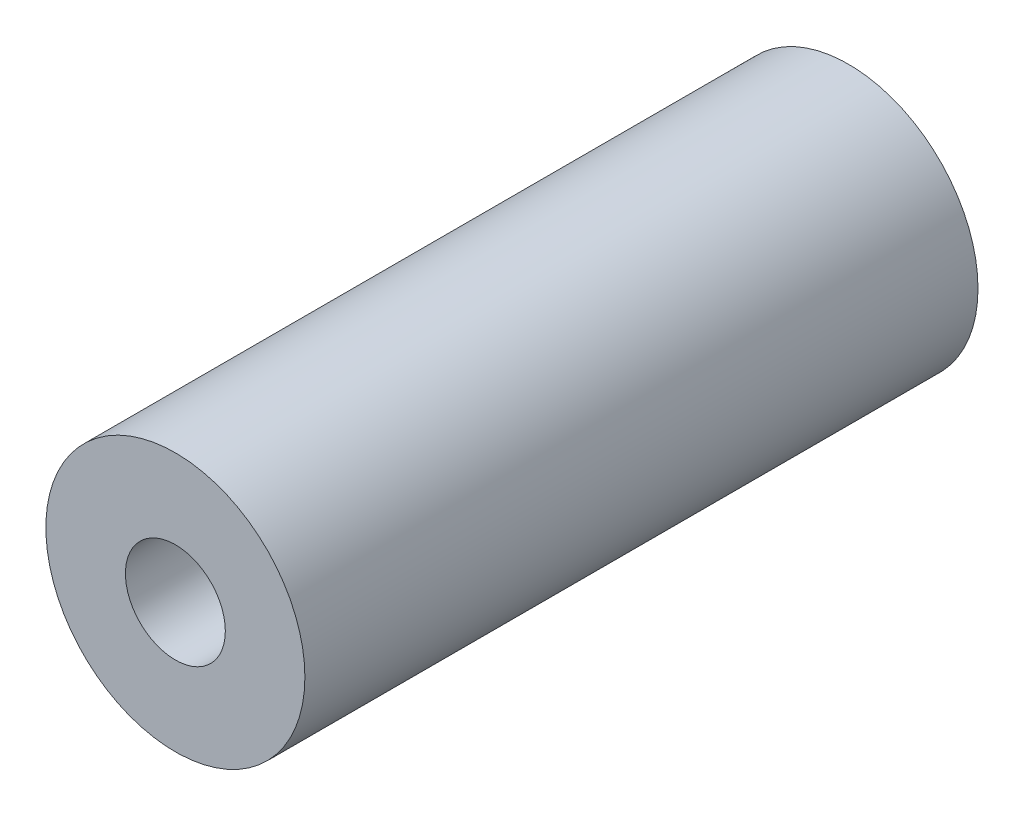
ISO-10303-21;
HEADER;
FILE_DESCRIPTION(('STEP AP214'),'2;1');
FILE_NAME('part.step','',(''),(''),'','','');
FILE_SCHEMA(('AUTOMOTIVE_DESIGN { 1 0 10303 214 1 1 1 1 }'));
ENDSEC;
DATA;
#1=APPLICATION_CONTEXT('core data for automotive mechanical design processes');
#2=APPLICATION_PROTOCOL_DEFINITION('international standard','automotive_design',2000,#1);
#3=PRODUCT_CONTEXT('',#1,'mechanical');
#4=PRODUCT('Part','Part','',(#3));
#5=PRODUCT_RELATED_PRODUCT_CATEGORY('part','',(#4));
#6=PRODUCT_DEFINITION_FORMATION('','',#4);
#7=PRODUCT_DEFINITION_CONTEXT('part definition',#1,'design');
#8=PRODUCT_DEFINITION('design','',#6,#7);
#9=PRODUCT_DEFINITION_SHAPE('','',#8);
#10=(LENGTH_UNIT() NAMED_UNIT(*) SI_UNIT(.MILLI.,.METRE.));
#11=(NAMED_UNIT(*) PLANE_ANGLE_UNIT() SI_UNIT($,.RADIAN.));
#12=(NAMED_UNIT(*) SI_UNIT($,.STERADIAN.) SOLID_ANGLE_UNIT());
#13=UNCERTAINTY_MEASURE_WITH_UNIT(LENGTH_MEASURE(1.E-05),#10,'distance_accuracy_value','');
#14=(GEOMETRIC_REPRESENTATION_CONTEXT(3) GLOBAL_UNCERTAINTY_ASSIGNED_CONTEXT((#13)) GLOBAL_UNIT_ASSIGNED_CONTEXT((#10,
#11,#12)) REPRESENTATION_CONTEXT('',''));
#15=CARTESIAN_POINT('',(0.,0.,0.));
#16=DIRECTION('',(0.,0.,1.));
#17=DIRECTION('',(1.,0.,0.));
#18=AXIS2_PLACEMENT_3D('',#15,#16,#17);
#19=CARTESIAN_POINT('',(0.,0.,-28.0874717674304));
#20=DIRECTION('',(0.,0.,1.));
#21=DIRECTION('',(1.,0.,0.));
#22=AXIS2_PLACEMENT_3D('',#19,#20,#21);
#23=CYLINDRICAL_SURFACE('',#22,3.5);
#24=CARTESIAN_POINT('',(0.,0.,0.));
#25=DIRECTION('',(0.,0.,1.));
#26=DIRECTION('',(1.,0.,0.));
#27=AXIS2_PLACEMENT_3D('',#24,#25,#26);
#28=CIRCLE('',#27,3.5);
#29=CARTESIAN_POINT('',(3.5,0.,0.));
#30=VERTEX_POINT('',#29);
#31=EDGE_CURVE('E42',#30,#30,#28,.T.);
#32=ORIENTED_EDGE('',*,*,#31,.F.);
#33=EDGE_LOOP('',(#32));
#34=FACE_BOUND('',#33,.T.);
#35=CARTESIAN_POINT('',(0.,0.,-18.1879768308187));
#36=DIRECTION('',(0.,0.,-1.));
#37=DIRECTION('',(-1.,0.,0.));
#38=AXIS2_PLACEMENT_3D('',#35,#36,#37);
#39=CIRCLE('',#38,3.5);
#40=CARTESIAN_POINT('',(-3.5,0.,-18.1879768308187));
#41=VERTEX_POINT('',#40);
#42=EDGE_CURVE('E51',#41,#41,#39,.F.);
#43=ORIENTED_EDGE('',*,*,#42,.T.);
#44=EDGE_LOOP('',(#43));
#45=FACE_BOUND('',#44,.T.);
#46=ADVANCED_FACE('F35',(#34,#45),#23,.T.);
#47=CARTESIAN_POINT('',(0.,0.,-28.0874717674304));
#48=DIRECTION('',(0.,0.,1.));
#49=DIRECTION('',(1.,0.,0.));
#50=AXIS2_PLACEMENT_3D('',#47,#48,#49);
#51=CYLINDRICAL_SURFACE('',#50,1.35);
#52=CARTESIAN_POINT('',(0.,0.,0.));
#53=DIRECTION('',(0.,0.,1.));
#54=DIRECTION('',(1.,0.,0.));
#55=AXIS2_PLACEMENT_3D('',#52,#53,#54);
#56=CIRCLE('',#55,1.35);
#57=CARTESIAN_POINT('',(1.35,0.,0.));
#58=VERTEX_POINT('',#57);
#59=EDGE_CURVE('E46',#58,#58,#56,.T.);
#60=ORIENTED_EDGE('',*,*,#59,.T.);
#61=EDGE_LOOP('',(#60));
#62=FACE_BOUND('',#61,.T.);
#63=CARTESIAN_POINT('',(0.,0.,-18.1879768308187));
#64=DIRECTION('',(0.,0.,-1.));
#65=DIRECTION('',(-1.,0.,0.));
#66=AXIS2_PLACEMENT_3D('',#63,#64,#65);
#67=CIRCLE('',#66,1.35);
#68=CARTESIAN_POINT('',(-1.35,0.,-18.1879768308187));
#69=VERTEX_POINT('',#68);
#70=EDGE_CURVE('E10',#69,#69,#67,.F.);
#71=ORIENTED_EDGE('',*,*,#70,.F.);
#72=EDGE_LOOP('',(#71));
#73=FACE_BOUND('',#72,.T.);
#74=ADVANCED_FACE('F62',(#62,#73),#51,.F.);
#75=CARTESIAN_POINT('',(0.,0.,0.));
#76=DIRECTION('',(0.,0.,1.));
#77=DIRECTION('',(1.,0.,0.));
#78=AXIS2_PLACEMENT_3D('',#75,#76,#77);
#79=PLANE('',#78);
#80=ORIENTED_EDGE('',*,*,#59,.F.);
#81=EDGE_LOOP('',(#80));
#82=FACE_BOUND('',#81,.T.);
#83=ORIENTED_EDGE('',*,*,#31,.T.);
#84=EDGE_LOOP('',(#83));
#85=FACE_BOUND('',#84,.T.);
#86=ADVANCED_FACE('F58',(#82,#85),#79,.T.);
#87=CARTESIAN_POINT('',(-0.825224838430435,17.4805321419561,-18.1879768308187));
#88=DIRECTION('',(0.,0.,-1.));
#89=DIRECTION('',(0.998887550969063,0.047155705052803,0.));
#90=AXIS2_PLACEMENT_3D('',#87,#88,#89);
#91=PLANE('',#90);
#92=ORIENTED_EDGE('',*,*,#42,.F.);
#93=EDGE_LOOP('',(#92));
#94=FACE_BOUND('',#93,.T.);
#95=ORIENTED_EDGE('',*,*,#70,.T.);
#96=EDGE_LOOP('',(#95));
#97=FACE_BOUND('',#96,.T.);
#98=ADVANCED_FACE('F37',(#94,#97),#91,.T.);
#99=CLOSED_SHELL('',(#46,#74,#86,#98));
#100=MANIFOLD_SOLID_BREP('B2',#99);
#101=ADVANCED_BREP_SHAPE_REPRESENTATION('',(#18,#100),#14);
#102=SHAPE_DEFINITION_REPRESENTATION(#9,#101);
ENDSEC;
END-ISO-10303-21;
